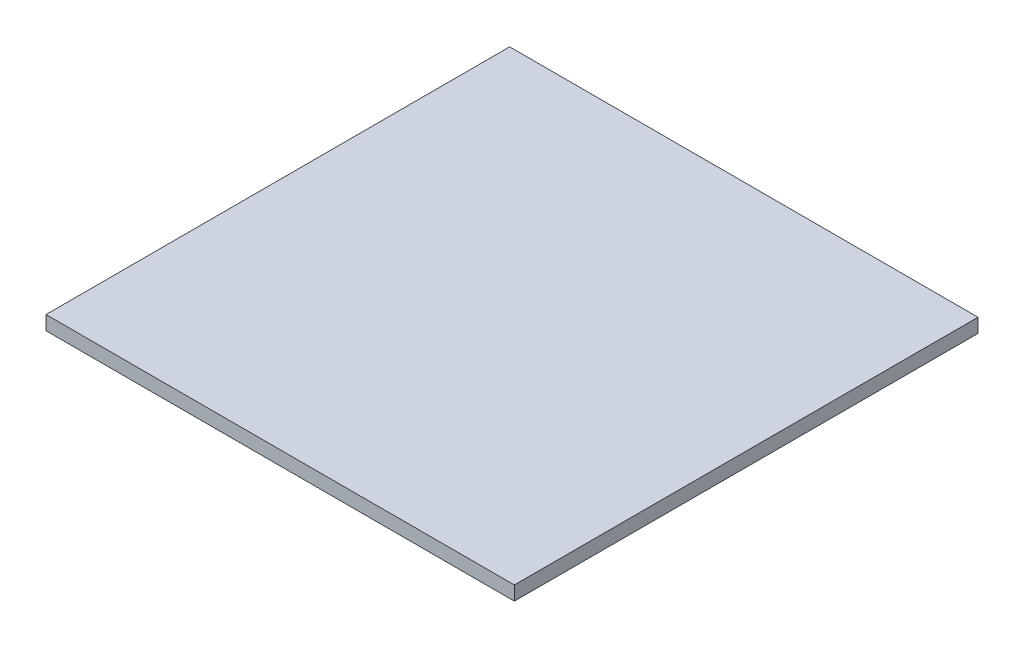
ISO-10303-21;
HEADER;
FILE_DESCRIPTION(('STEP AP214'),'2;1');
FILE_NAME('part.step','',(''),(''),'','','');
FILE_SCHEMA(('AUTOMOTIVE_DESIGN { 1 0 10303 214 1 1 1 1 }'));
ENDSEC;
DATA;
#1=APPLICATION_CONTEXT('core data for automotive mechanical design processes');
#2=APPLICATION_PROTOCOL_DEFINITION('international standard','automotive_design',2000,#1);
#3=PRODUCT_CONTEXT('',#1,'mechanical');
#4=PRODUCT('Part','Part','',(#3));
#5=PRODUCT_RELATED_PRODUCT_CATEGORY('part','',(#4));
#6=PRODUCT_DEFINITION_FORMATION('','',#4);
#7=PRODUCT_DEFINITION_CONTEXT('part definition',#1,'design');
#8=PRODUCT_DEFINITION('design','',#6,#7);
#9=PRODUCT_DEFINITION_SHAPE('','',#8);
#10=(LENGTH_UNIT() NAMED_UNIT(*) SI_UNIT(.MILLI.,.METRE.));
#11=(NAMED_UNIT(*) PLANE_ANGLE_UNIT() SI_UNIT($,.RADIAN.));
#12=(NAMED_UNIT(*) SI_UNIT($,.STERADIAN.) SOLID_ANGLE_UNIT());
#13=UNCERTAINTY_MEASURE_WITH_UNIT(LENGTH_MEASURE(1.E-05),#10,'distance_accuracy_value','');
#14=(GEOMETRIC_REPRESENTATION_CONTEXT(3) GLOBAL_UNCERTAINTY_ASSIGNED_CONTEXT((#13)) GLOBAL_UNIT_ASSIGNED_CONTEXT((#10,
#11,#12)) REPRESENTATION_CONTEXT('',''));
#15=CARTESIAN_POINT('',(0.,0.,0.));
#16=DIRECTION('',(0.,0.,1.));
#17=DIRECTION('',(1.,0.,0.));
#18=AXIS2_PLACEMENT_3D('',#15,#16,#17);
#19=CARTESIAN_POINT('',(-25.,1.5,-25.));
#20=DIRECTION('',(1.,0.,0.));
#21=DIRECTION('',(0.,0.,-1.));
#22=AXIS2_PLACEMENT_3D('',#19,#20,#21);
#23=PLANE('',#22);
#24=DIRECTION('',(0.,0.,1.));
#25=VECTOR('',#24,1.);
#26=CARTESIAN_POINT('',(-25.,0.,-25.));
#27=LINE('',#26,#25);
#28=CARTESIAN_POINT('',(-25.,0.,-25.));
#29=VERTEX_POINT('',#28);
#30=CARTESIAN_POINT('',(-25.,0.,24.5));
#31=VERTEX_POINT('',#30);
#32=EDGE_CURVE('E102',#29,#31,#27,.T.);
#33=ORIENTED_EDGE('',*,*,#32,.T.);
#34=DIRECTION('',(0.,-1.,0.));
#35=VECTOR('',#34,1.);
#36=CARTESIAN_POINT('',(-25.,1.5,24.5));
#37=LINE('',#36,#35);
#38=CARTESIAN_POINT('',(-25.,1.5,24.5));
#39=VERTEX_POINT('',#38);
#40=EDGE_CURVE('E11',#39,#31,#37,.T.);
#41=ORIENTED_EDGE('',*,*,#40,.F.);
#42=DIRECTION('',(0.,0.,1.));
#43=VECTOR('',#42,1.);
#44=CARTESIAN_POINT('',(-25.,1.5,-25.));
#45=LINE('',#44,#43);
#46=CARTESIAN_POINT('',(-25.,1.5,-25.));
#47=VERTEX_POINT('',#46);
#48=EDGE_CURVE('E90',#47,#39,#45,.T.);
#49=ORIENTED_EDGE('',*,*,#48,.F.);
#50=DIRECTION('',(0.,-1.,0.));
#51=VECTOR('',#50,1.);
#52=CARTESIAN_POINT('',(-25.,1.5,-25.));
#53=LINE('',#52,#51);
#54=EDGE_CURVE('E98',#47,#29,#53,.T.);
#55=ORIENTED_EDGE('',*,*,#54,.T.);
#56=EDGE_LOOP('',(#33,#41,#49,#55));
#57=FACE_BOUND('',#56,.T.);
#58=ADVANCED_FACE('F39',(#57),#23,.F.);
#59=CARTESIAN_POINT('',(-25.,1.5,24.5));
#60=DIRECTION('',(0.,0.,-1.));
#61=DIRECTION('',(-1.,0.,0.));
#62=AXIS2_PLACEMENT_3D('',#59,#60,#61);
#63=PLANE('',#62);
#64=DIRECTION('',(1.,0.,0.));
#65=VECTOR('',#64,1.);
#66=CARTESIAN_POINT('',(-25.,0.,24.5));
#67=LINE('',#66,#65);
#68=CARTESIAN_POINT('',(25.,0.,24.5));
#69=VERTEX_POINT('',#68);
#70=EDGE_CURVE('E94',#31,#69,#67,.T.);
#71=ORIENTED_EDGE('',*,*,#70,.T.);
#72=DIRECTION('',(0.,-1.,0.));
#73=VECTOR('',#72,1.);
#74=CARTESIAN_POINT('',(25.,1.5,24.5));
#75=LINE('',#74,#73);
#76=CARTESIAN_POINT('',(25.,1.5,24.5));
#77=VERTEX_POINT('',#76);
#78=EDGE_CURVE('E47',#77,#69,#75,.T.);
#79=ORIENTED_EDGE('',*,*,#78,.F.);
#80=DIRECTION('',(1.,0.,0.));
#81=VECTOR('',#80,1.);
#82=CARTESIAN_POINT('',(-25.,1.5,24.5));
#83=LINE('',#82,#81);
#84=EDGE_CURVE('E85',#39,#77,#83,.T.);
#85=ORIENTED_EDGE('',*,*,#84,.F.);
#86=ORIENTED_EDGE('',*,*,#40,.T.);
#87=EDGE_LOOP('',(#71,#79,#85,#86));
#88=FACE_BOUND('',#87,.T.);
#89=ADVANCED_FACE('F93',(#88),#63,.F.);
#90=CARTESIAN_POINT('',(25.,1.5,-25.));
#91=DIRECTION('',(-1.,0.,0.));
#92=DIRECTION('',(0.,0.,1.));
#93=AXIS2_PLACEMENT_3D('',#90,#91,#92);
#94=PLANE('',#93);
#95=DIRECTION('',(0.,0.,-1.));
#96=VECTOR('',#95,1.);
#97=CARTESIAN_POINT('',(25.,0.,-25.));
#98=LINE('',#97,#96);
#99=CARTESIAN_POINT('',(25.,0.,-25.));
#100=VERTEX_POINT('',#99);
#101=EDGE_CURVE('E72',#69,#100,#98,.T.);
#102=ORIENTED_EDGE('',*,*,#101,.T.);
#103=DIRECTION('',(0.,-1.,0.));
#104=VECTOR('',#103,1.);
#105=CARTESIAN_POINT('',(25.,1.5,-25.));
#106=LINE('',#105,#104);
#107=CARTESIAN_POINT('',(25.,1.5,-25.));
#108=VERTEX_POINT('',#107);
#109=EDGE_CURVE('E95',#108,#100,#106,.T.);
#110=ORIENTED_EDGE('',*,*,#109,.F.);
#111=DIRECTION('',(0.,0.,-1.));
#112=VECTOR('',#111,1.);
#113=CARTESIAN_POINT('',(25.,1.5,-25.));
#114=LINE('',#113,#112);
#115=EDGE_CURVE('E88',#77,#108,#114,.T.);
#116=ORIENTED_EDGE('',*,*,#115,.F.);
#117=ORIENTED_EDGE('',*,*,#78,.T.);
#118=EDGE_LOOP('',(#102,#110,#116,#117));
#119=FACE_BOUND('',#118,.T.);
#120=ADVANCED_FACE('F96',(#119),#94,.F.);
#121=CARTESIAN_POINT('',(-25.,1.5,-25.));
#122=DIRECTION('',(0.,0.,1.));
#123=DIRECTION('',(1.,0.,0.));
#124=AXIS2_PLACEMENT_3D('',#121,#122,#123);
#125=PLANE('',#124);
#126=DIRECTION('',(-1.,0.,0.));
#127=VECTOR('',#126,1.);
#128=CARTESIAN_POINT('',(-25.,0.,-25.));
#129=LINE('',#128,#127);
#130=EDGE_CURVE('E78',#100,#29,#129,.T.);
#131=ORIENTED_EDGE('',*,*,#130,.T.);
#132=ORIENTED_EDGE('',*,*,#54,.F.);
#133=DIRECTION('',(-1.,0.,0.));
#134=VECTOR('',#133,1.);
#135=CARTESIAN_POINT('',(-25.,1.5,-25.));
#136=LINE('',#135,#134);
#137=EDGE_CURVE('E55',#108,#47,#136,.T.);
#138=ORIENTED_EDGE('',*,*,#137,.F.);
#139=ORIENTED_EDGE('',*,*,#109,.T.);
#140=EDGE_LOOP('',(#131,#132,#138,#139));
#141=FACE_BOUND('',#140,.T.);
#142=ADVANCED_FACE('F109',(#141),#125,.F.);
#143=CARTESIAN_POINT('',(0.,1.5,0.));
#144=DIRECTION('',(0.,1.,0.));
#145=DIRECTION('',(0.,0.,1.));
#146=AXIS2_PLACEMENT_3D('',#143,#144,#145);
#147=PLANE('',#146);
#148=ORIENTED_EDGE('',*,*,#48,.T.);
#149=ORIENTED_EDGE('',*,*,#84,.T.);
#150=ORIENTED_EDGE('',*,*,#115,.T.);
#151=ORIENTED_EDGE('',*,*,#137,.T.);
#152=EDGE_LOOP('',(#148,#149,#150,#151));
#153=FACE_BOUND('',#152,.T.);
#154=ADVANCED_FACE('F86',(#153),#147,.T.);
#155=CARTESIAN_POINT('',(0.,0.,0.));
#156=DIRECTION('',(0.,1.,0.));
#157=DIRECTION('',(0.,0.,1.));
#158=AXIS2_PLACEMENT_3D('',#155,#156,#157);
#159=PLANE('',#158);
#160=ORIENTED_EDGE('',*,*,#32,.F.);
#161=ORIENTED_EDGE('',*,*,#130,.F.);
#162=ORIENTED_EDGE('',*,*,#101,.F.);
#163=ORIENTED_EDGE('',*,*,#70,.F.);
#164=EDGE_LOOP('',(#160,#161,#162,#163));
#165=FACE_BOUND('',#164,.T.);
#166=ADVANCED_FACE('F112',(#165),#159,.F.);
#167=CLOSED_SHELL('',(#58,#89,#120,#142,#154,#166));
#168=MANIFOLD_SOLID_BREP('B2',#167);
#169=ADVANCED_BREP_SHAPE_REPRESENTATION('',(#18,#168),#14);
#170=SHAPE_DEFINITION_REPRESENTATION(#9,#169);
ENDSEC;
END-ISO-10303-21;
